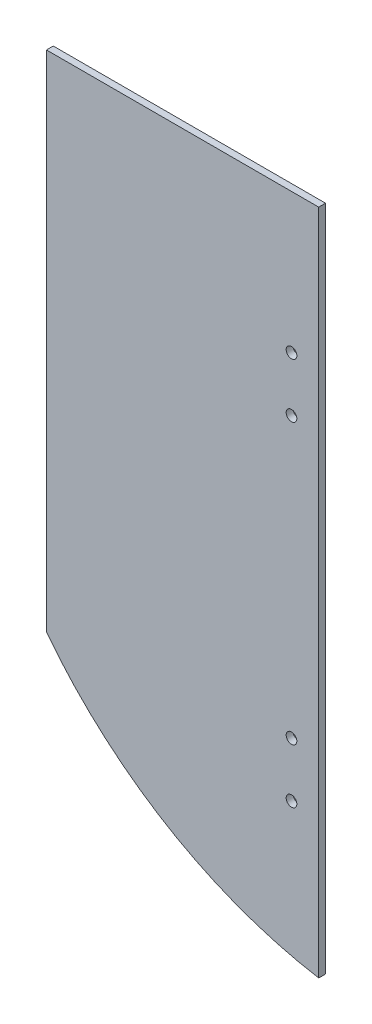
ISO-10303-21;
HEADER;
FILE_DESCRIPTION(('STEP AP214'),'2;1');
FILE_NAME('part.step','',(''),(''),'','','');
FILE_SCHEMA(('AUTOMOTIVE_DESIGN { 1 0 10303 214 1 1 1 1 }'));
ENDSEC;
DATA;
#1=APPLICATION_CONTEXT('core data for automotive mechanical design processes');
#2=APPLICATION_PROTOCOL_DEFINITION('international standard','automotive_design',2000,#1);
#3=PRODUCT_CONTEXT('',#1,'mechanical');
#4=PRODUCT('Part','Part','',(#3));
#5=PRODUCT_RELATED_PRODUCT_CATEGORY('part','',(#4));
#6=PRODUCT_DEFINITION_FORMATION('','',#4);
#7=PRODUCT_DEFINITION_CONTEXT('part definition',#1,'design');
#8=PRODUCT_DEFINITION('design','',#6,#7);
#9=PRODUCT_DEFINITION_SHAPE('','',#8);
#10=(LENGTH_UNIT() NAMED_UNIT(*) SI_UNIT(.MILLI.,.METRE.));
#11=(NAMED_UNIT(*) PLANE_ANGLE_UNIT() SI_UNIT($,.RADIAN.));
#12=(NAMED_UNIT(*) SI_UNIT($,.STERADIAN.) SOLID_ANGLE_UNIT());
#13=UNCERTAINTY_MEASURE_WITH_UNIT(LENGTH_MEASURE(1.E-05),#10,'distance_accuracy_value','');
#14=(GEOMETRIC_REPRESENTATION_CONTEXT(3) GLOBAL_UNCERTAINTY_ASSIGNED_CONTEXT((#13)) GLOBAL_UNIT_ASSIGNED_CONTEXT((#10,
#11,#12)) REPRESENTATION_CONTEXT('',''));
#15=CARTESIAN_POINT('',(0.,0.,0.));
#16=DIRECTION('',(0.,0.,1.));
#17=DIRECTION('',(1.,0.,0.));
#18=AXIS2_PLACEMENT_3D('',#15,#16,#17);
#19=CARTESIAN_POINT('',(63.5,155.702,3.175));
#20=DIRECTION('',(0.,-1.,0.));
#21=DIRECTION('',(0.,0.,-1.));
#22=AXIS2_PLACEMENT_3D('',#19,#20,#21);
#23=PLANE('',#22);
#24=DIRECTION('',(-1.,0.,0.));
#25=VECTOR('',#24,1.);
#26=CARTESIAN_POINT('',(63.5,155.702,0.));
#27=LINE('',#26,#25);
#28=CARTESIAN_POINT('',(63.5,155.702,0.));
#29=VERTEX_POINT('',#28);
#30=CARTESIAN_POINT('',(-63.5,155.702,0.));
#31=VERTEX_POINT('',#30);
#32=EDGE_CURVE('E97',#29,#31,#27,.T.);
#33=ORIENTED_EDGE('',*,*,#32,.T.);
#34=DIRECTION('',(0.,0.,-1.));
#35=VECTOR('',#34,1.);
#36=CARTESIAN_POINT('',(-63.5,155.702,3.175));
#37=LINE('',#36,#35);
#38=CARTESIAN_POINT('',(-63.5,155.702,3.175));
#39=VERTEX_POINT('',#38);
#40=EDGE_CURVE('E11',#39,#31,#37,.T.);
#41=ORIENTED_EDGE('',*,*,#40,.F.);
#42=DIRECTION('',(-1.,0.,0.));
#43=VECTOR('',#42,1.);
#44=CARTESIAN_POINT('',(63.5,155.702,3.175));
#45=LINE('',#44,#43);
#46=CARTESIAN_POINT('',(63.5,155.702,3.175));
#47=VERTEX_POINT('',#46);
#48=EDGE_CURVE('E91',#47,#39,#45,.T.);
#49=ORIENTED_EDGE('',*,*,#48,.F.);
#50=DIRECTION('',(0.,0.,-1.));
#51=VECTOR('',#50,1.);
#52=CARTESIAN_POINT('',(63.5,155.702,3.175));
#53=LINE('',#52,#51);
#54=EDGE_CURVE('E85',#47,#29,#53,.T.);
#55=ORIENTED_EDGE('',*,*,#54,.T.);
#56=EDGE_LOOP('',(#33,#41,#49,#55));
#57=FACE_BOUND('',#56,.T.);
#58=ADVANCED_FACE('F44',(#57),#23,.F.);
#59=CARTESIAN_POINT('',(-63.5,-155.702,3.175));
#60=DIRECTION('',(1.,0.,0.));
#61=DIRECTION('',(0.,0.,-1.));
#62=AXIS2_PLACEMENT_3D('',#59,#60,#61);
#63=PLANE('',#62);
#64=DIRECTION('',(0.,-1.,0.));
#65=VECTOR('',#64,1.);
#66=CARTESIAN_POINT('',(-63.5,-155.702,0.));
#67=LINE('',#66,#65);
#68=CARTESIAN_POINT('',(-63.5,-79.502,0.));
#69=VERTEX_POINT('',#68);
#70=EDGE_CURVE('E92',#31,#69,#67,.T.);
#71=ORIENTED_EDGE('',*,*,#70,.T.);
#72=DIRECTION('',(0.,0.,1.));
#73=VECTOR('',#72,1.);
#74=CARTESIAN_POINT('',(-63.5,-79.502,0.));
#75=LINE('',#74,#73);
#76=CARTESIAN_POINT('',(-63.5,-79.502,3.175));
#77=VERTEX_POINT('',#76);
#78=EDGE_CURVE('E59',#69,#77,#75,.T.);
#79=ORIENTED_EDGE('',*,*,#78,.T.);
#80=DIRECTION('',(0.,-1.,0.));
#81=VECTOR('',#80,1.);
#82=CARTESIAN_POINT('',(-63.5,-155.702,3.175));
#83=LINE('',#82,#81);
#84=EDGE_CURVE('E117',#39,#77,#83,.T.);
#85=ORIENTED_EDGE('',*,*,#84,.F.);
#86=ORIENTED_EDGE('',*,*,#40,.T.);
#87=EDGE_LOOP('',(#71,#79,#85,#86));
#88=FACE_BOUND('',#87,.T.);
#89=ADVANCED_FACE('F157',(#88),#63,.F.);
#90=CARTESIAN_POINT('',(63.5,-155.702,3.175));
#91=DIRECTION('',(-1.,0.,0.));
#92=DIRECTION('',(0.,0.,1.));
#93=AXIS2_PLACEMENT_3D('',#90,#91,#92);
#94=PLANE('',#93);
#95=DIRECTION('',(0.,1.,0.));
#96=VECTOR('',#95,1.);
#97=CARTESIAN_POINT('',(63.5,-155.702,0.));
#98=LINE('',#97,#96);
#99=CARTESIAN_POINT('',(63.5,-155.702,0.));
#100=VERTEX_POINT('',#99);
#101=EDGE_CURVE('E82',#100,#29,#98,.T.);
#102=ORIENTED_EDGE('',*,*,#101,.T.);
#103=ORIENTED_EDGE('',*,*,#54,.F.);
#104=DIRECTION('',(0.,1.,0.));
#105=VECTOR('',#104,1.);
#106=CARTESIAN_POINT('',(63.5,-155.702,3.175));
#107=LINE('',#106,#105);
#108=CARTESIAN_POINT('',(63.5,-155.702,3.175));
#109=VERTEX_POINT('',#108);
#110=EDGE_CURVE('E68',#109,#47,#107,.T.);
#111=ORIENTED_EDGE('',*,*,#110,.F.);
#112=DIRECTION('',(0.,0.,-1.));
#113=VECTOR('',#112,1.);
#114=CARTESIAN_POINT('',(63.5,-155.702,3.175));
#115=LINE('',#114,#113);
#116=EDGE_CURVE('E52',#109,#100,#115,.T.);
#117=ORIENTED_EDGE('',*,*,#116,.T.);
#118=EDGE_LOOP('',(#102,#103,#111,#117));
#119=FACE_BOUND('',#118,.T.);
#120=ADVANCED_FACE('F84',(#119),#94,.F.);
#121=CARTESIAN_POINT('',(0.,0.,3.175));
#122=DIRECTION('',(0.,0.,-1.));
#123=DIRECTION('',(-1.,0.,0.));
#124=AXIS2_PLACEMENT_3D('',#121,#122,#123);
#125=PLANE('',#124);
#126=CARTESIAN_POINT('',(50.8,-90.551,3.175));
#127=DIRECTION('',(0.,0.,1.));
#128=DIRECTION('',(1.,0.,0.));
#129=AXIS2_PLACEMENT_3D('',#126,#127,#128);
#130=CIRCLE('',#129,2.48919999999999);
#131=CARTESIAN_POINT('',(53.2892,-90.551,3.175));
#132=VERTEX_POINT('',#131);
#133=EDGE_CURVE('E145',#132,#132,#130,.T.);
#134=ORIENTED_EDGE('',*,*,#133,.F.);
#135=EDGE_LOOP('',(#134));
#136=FACE_BOUND('',#135,.T.);
#137=CARTESIAN_POINT('',(50.8,-65.151,3.175));
#138=DIRECTION('',(0.,0.,1.));
#139=DIRECTION('',(1.,0.,0.));
#140=AXIS2_PLACEMENT_3D('',#137,#138,#139);
#141=CIRCLE('',#140,2.48919999999999);
#142=CARTESIAN_POINT('',(53.2892,-65.151,3.175));
#143=VERTEX_POINT('',#142);
#144=EDGE_CURVE('E137',#143,#143,#141,.T.);
#145=ORIENTED_EDGE('',*,*,#144,.F.);
#146=EDGE_LOOP('',(#145));
#147=FACE_BOUND('',#146,.T.);
#148=CARTESIAN_POINT('',(50.8,65.151,3.175));
#149=DIRECTION('',(0.,0.,1.));
#150=DIRECTION('',(1.,0.,0.));
#151=AXIS2_PLACEMENT_3D('',#148,#149,#150);
#152=CIRCLE('',#151,2.48919999999999);
#153=CARTESIAN_POINT('',(53.2892,65.151,3.175));
#154=VERTEX_POINT('',#153);
#155=EDGE_CURVE('E129',#154,#154,#152,.T.);
#156=ORIENTED_EDGE('',*,*,#155,.F.);
#157=EDGE_LOOP('',(#156));
#158=FACE_BOUND('',#157,.T.);
#159=CARTESIAN_POINT('',(50.8,90.551,3.175));
#160=DIRECTION('',(0.,0.,1.));
#161=DIRECTION('',(1.,0.,0.));
#162=AXIS2_PLACEMENT_3D('',#159,#160,#161);
#163=CIRCLE('',#162,2.48919999999999);
#164=CARTESIAN_POINT('',(53.2892,90.551,3.175));
#165=VERTEX_POINT('',#164);
#166=EDGE_CURVE('E110',#165,#165,#163,.T.);
#167=ORIENTED_EDGE('',*,*,#166,.F.);
#168=EDGE_LOOP('',(#167));
#169=FACE_BOUND('',#168,.T.);
#170=ORIENTED_EDGE('',*,*,#84,.T.);
#171=CARTESIAN_POINT('',(97.3558391251635,44.6577318752724,3.175));
#172=DIRECTION('',(0.,0.,-1.));
#173=DIRECTION('',(1.,0.,0.));
#174=AXIS2_PLACEMENT_3D('',#171,#172,#173);
#175=CIRCLE('',#174,203.2);
#176=EDGE_CURVE('E152',#109,#77,#175,.T.);
#177=ORIENTED_EDGE('',*,*,#176,.F.);
#178=ORIENTED_EDGE('',*,*,#110,.T.);
#179=ORIENTED_EDGE('',*,*,#48,.T.);
#180=EDGE_LOOP('',(#170,#177,#178,#179));
#181=FACE_BOUND('',#180,.T.);
#182=ADVANCED_FACE('F159',(#136,#147,#158,#169,#181),#125,.F.);
#183=CARTESIAN_POINT('',(0.,0.,0.));
#184=DIRECTION('',(0.,0.,-1.));
#185=DIRECTION('',(-1.,0.,0.));
#186=AXIS2_PLACEMENT_3D('',#183,#184,#185);
#187=PLANE('',#186);
#188=CARTESIAN_POINT('',(97.3558391251635,44.6577318752724,0.));
#189=DIRECTION('',(0.,0.,-1.));
#190=DIRECTION('',(1.,0.,0.));
#191=AXIS2_PLACEMENT_3D('',#188,#189,#190);
#192=CIRCLE('',#191,203.2);
#193=EDGE_CURVE('E151',#100,#69,#192,.T.);
#194=ORIENTED_EDGE('',*,*,#193,.T.);
#195=ORIENTED_EDGE('',*,*,#70,.F.);
#196=ORIENTED_EDGE('',*,*,#32,.F.);
#197=ORIENTED_EDGE('',*,*,#101,.F.);
#198=EDGE_LOOP('',(#194,#195,#196,#197));
#199=FACE_BOUND('',#198,.T.);
#200=CARTESIAN_POINT('',(50.8,-90.551,0.));
#201=DIRECTION('',(0.,0.,1.));
#202=DIRECTION('',(1.,0.,0.));
#203=AXIS2_PLACEMENT_3D('',#200,#201,#202);
#204=CIRCLE('',#203,2.4892);
#205=CARTESIAN_POINT('',(53.2892,-90.551,0.));
#206=VERTEX_POINT('',#205);
#207=EDGE_CURVE('E141',#206,#206,#204,.T.);
#208=ORIENTED_EDGE('',*,*,#207,.T.);
#209=EDGE_LOOP('',(#208));
#210=FACE_BOUND('',#209,.T.);
#211=CARTESIAN_POINT('',(50.8,-65.151,0.));
#212=DIRECTION('',(0.,0.,1.));
#213=DIRECTION('',(1.,0.,0.));
#214=AXIS2_PLACEMENT_3D('',#211,#212,#213);
#215=CIRCLE('',#214,2.4892);
#216=CARTESIAN_POINT('',(53.2892,-65.151,0.));
#217=VERTEX_POINT('',#216);
#218=EDGE_CURVE('E133',#217,#217,#215,.T.);
#219=ORIENTED_EDGE('',*,*,#218,.T.);
#220=EDGE_LOOP('',(#219));
#221=FACE_BOUND('',#220,.T.);
#222=CARTESIAN_POINT('',(50.8,65.151,0.));
#223=DIRECTION('',(0.,0.,1.));
#224=DIRECTION('',(1.,0.,0.));
#225=AXIS2_PLACEMENT_3D('',#222,#223,#224);
#226=CIRCLE('',#225,2.4892);
#227=CARTESIAN_POINT('',(53.2892,65.151,0.));
#228=VERTEX_POINT('',#227);
#229=EDGE_CURVE('E125',#228,#228,#226,.T.);
#230=ORIENTED_EDGE('',*,*,#229,.T.);
#231=EDGE_LOOP('',(#230));
#232=FACE_BOUND('',#231,.T.);
#233=CARTESIAN_POINT('',(50.8,90.551,0.));
#234=DIRECTION('',(0.,0.,1.));
#235=DIRECTION('',(1.,0.,0.));
#236=AXIS2_PLACEMENT_3D('',#233,#234,#235);
#237=CIRCLE('',#236,2.4892);
#238=CARTESIAN_POINT('',(53.2892,90.551,0.));
#239=VERTEX_POINT('',#238);
#240=EDGE_CURVE('E104',#239,#239,#237,.T.);
#241=ORIENTED_EDGE('',*,*,#240,.T.);
#242=EDGE_LOOP('',(#241));
#243=FACE_BOUND('',#242,.T.);
#244=ADVANCED_FACE('F100',(#199,#210,#221,#232,#243),#187,.T.);
#245=CARTESIAN_POINT('',(50.8,90.551,3.175));
#246=DIRECTION('',(0.,0.,1.));
#247=DIRECTION('',(1.,0.,0.));
#248=AXIS2_PLACEMENT_3D('',#245,#246,#247);
#249=CYLINDRICAL_SURFACE('',#248,2.48919999999999);
#250=ORIENTED_EDGE('',*,*,#240,.F.);
#251=EDGE_LOOP('',(#250));
#252=FACE_BOUND('',#251,.T.);
#253=ORIENTED_EDGE('',*,*,#166,.T.);
#254=EDGE_LOOP('',(#253));
#255=FACE_BOUND('',#254,.T.);
#256=ADVANCED_FACE('F185',(#252,#255),#249,.F.);
#257=CARTESIAN_POINT('',(50.8,65.151,3.175));
#258=DIRECTION('',(0.,0.,1.));
#259=DIRECTION('',(1.,0.,0.));
#260=AXIS2_PLACEMENT_3D('',#257,#258,#259);
#261=CYLINDRICAL_SURFACE('',#260,2.48919999999999);
#262=ORIENTED_EDGE('',*,*,#229,.F.);
#263=EDGE_LOOP('',(#262));
#264=FACE_BOUND('',#263,.T.);
#265=ORIENTED_EDGE('',*,*,#155,.T.);
#266=EDGE_LOOP('',(#265));
#267=FACE_BOUND('',#266,.T.);
#268=ADVANCED_FACE('F190',(#264,#267),#261,.F.);
#269=CARTESIAN_POINT('',(50.8,-65.151,3.175));
#270=DIRECTION('',(0.,0.,1.));
#271=DIRECTION('',(1.,0.,0.));
#272=AXIS2_PLACEMENT_3D('',#269,#270,#271);
#273=CYLINDRICAL_SURFACE('',#272,2.48919999999999);
#274=ORIENTED_EDGE('',*,*,#218,.F.);
#275=EDGE_LOOP('',(#274));
#276=FACE_BOUND('',#275,.T.);
#277=ORIENTED_EDGE('',*,*,#144,.T.);
#278=EDGE_LOOP('',(#277));
#279=FACE_BOUND('',#278,.T.);
#280=ADVANCED_FACE('F171',(#276,#279),#273,.F.);
#281=CARTESIAN_POINT('',(50.8,-90.551,3.175));
#282=DIRECTION('',(0.,0.,1.));
#283=DIRECTION('',(1.,0.,0.));
#284=AXIS2_PLACEMENT_3D('',#281,#282,#283);
#285=CYLINDRICAL_SURFACE('',#284,2.48919999999999);
#286=ORIENTED_EDGE('',*,*,#207,.F.);
#287=EDGE_LOOP('',(#286));
#288=FACE_BOUND('',#287,.T.);
#289=ORIENTED_EDGE('',*,*,#133,.T.);
#290=EDGE_LOOP('',(#289));
#291=FACE_BOUND('',#290,.T.);
#292=ADVANCED_FACE('F165',(#288,#291),#285,.F.);
#293=CARTESIAN_POINT('',(97.3558391251635,44.6577318752724,0.));
#294=DIRECTION('',(0.,0.,1.));
#295=DIRECTION('',(1.,0.,0.));
#296=AXIS2_PLACEMENT_3D('',#293,#294,#295);
#297=CYLINDRICAL_SURFACE('',#296,203.2);
#298=ORIENTED_EDGE('',*,*,#176,.T.);
#299=ORIENTED_EDGE('',*,*,#78,.F.);
#300=ORIENTED_EDGE('',*,*,#193,.F.);
#301=ORIENTED_EDGE('',*,*,#116,.F.);
#302=EDGE_LOOP('',(#298,#299,#300,#301));
#303=FACE_BOUND('',#302,.T.);
#304=ADVANCED_FACE('F163',(#303),#297,.T.);
#305=CLOSED_SHELL('',(#58,#89,#120,#182,#244,#256,#268,#280,#292,#304));
#306=MANIFOLD_SOLID_BREP('B2',#305);
#307=ADVANCED_BREP_SHAPE_REPRESENTATION('',(#18,#306),#14);
#308=SHAPE_DEFINITION_REPRESENTATION(#9,#307);
ENDSEC;
END-ISO-10303-21;
